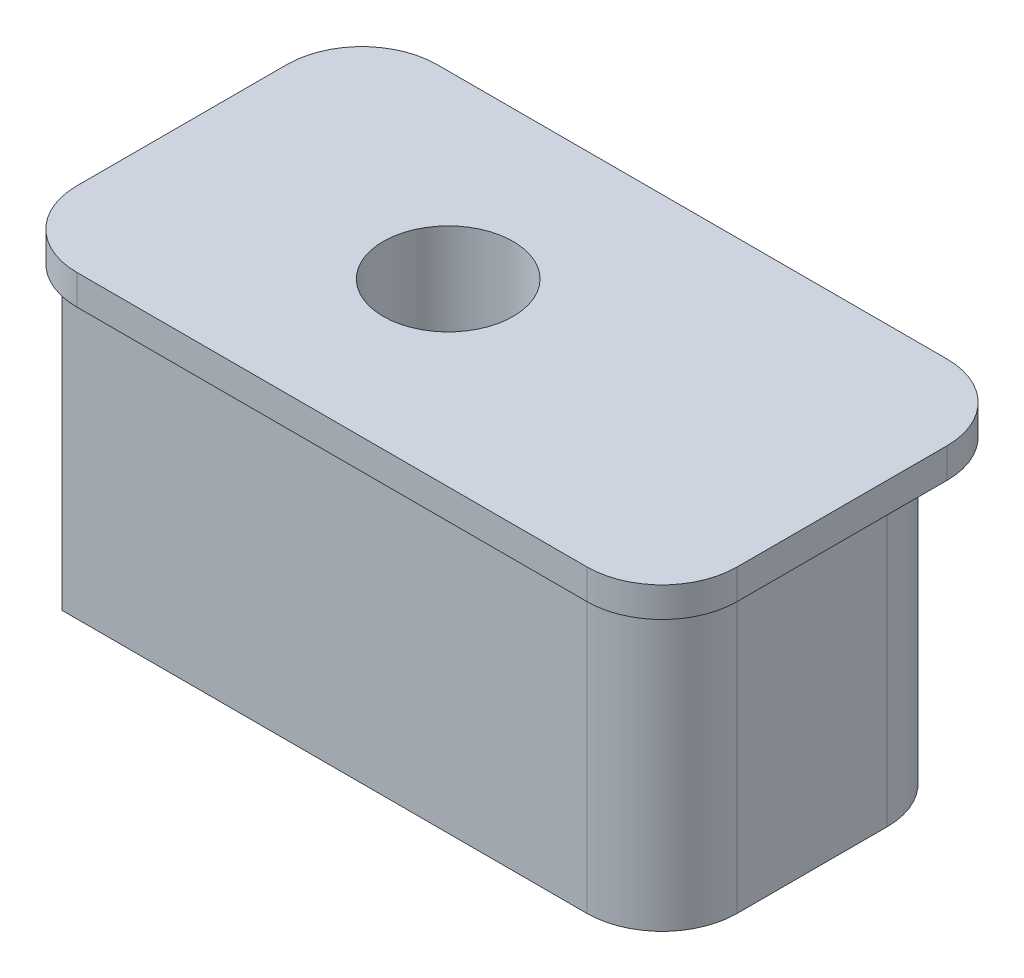
ISO-10303-21;
HEADER;
FILE_DESCRIPTION(('STEP AP214'),'2;1');
FILE_NAME('part.step','',(''),(''),'','','');
FILE_SCHEMA(('AUTOMOTIVE_DESIGN { 1 0 10303 214 1 1 1 1 }'));
ENDSEC;
DATA;
#1=APPLICATION_CONTEXT('core data for automotive mechanical design processes');
#2=APPLICATION_PROTOCOL_DEFINITION('international standard','automotive_design',2000,#1);
#3=PRODUCT_CONTEXT('',#1,'mechanical');
#4=PRODUCT('Part','Part','',(#3));
#5=PRODUCT_RELATED_PRODUCT_CATEGORY('part','',(#4));
#6=PRODUCT_DEFINITION_FORMATION('','',#4);
#7=PRODUCT_DEFINITION_CONTEXT('part definition',#1,'design');
#8=PRODUCT_DEFINITION('design','',#6,#7);
#9=PRODUCT_DEFINITION_SHAPE('','',#8);
#10=(LENGTH_UNIT() NAMED_UNIT(*) SI_UNIT(.MILLI.,.METRE.));
#11=(NAMED_UNIT(*) PLANE_ANGLE_UNIT() SI_UNIT($,.RADIAN.));
#12=(NAMED_UNIT(*) SI_UNIT($,.STERADIAN.) SOLID_ANGLE_UNIT());
#13=UNCERTAINTY_MEASURE_WITH_UNIT(LENGTH_MEASURE(1.E-05),#10,'distance_accuracy_value','');
#14=(GEOMETRIC_REPRESENTATION_CONTEXT(3) GLOBAL_UNCERTAINTY_ASSIGNED_CONTEXT((#13)) GLOBAL_UNIT_ASSIGNED_CONTEXT((#10,
#11,#12)) REPRESENTATION_CONTEXT('',''));
#15=CARTESIAN_POINT('',(0.,0.,0.));
#16=DIRECTION('',(0.,0.,1.));
#17=DIRECTION('',(1.,0.,0.));
#18=AXIS2_PLACEMENT_3D('',#15,#16,#17);
#19=CARTESIAN_POINT('',(0.,12.7,0.));
#20=DIRECTION('',(1.,0.,0.));
#21=DIRECTION('',(0.,0.,-1.));
#22=AXIS2_PLACEMENT_3D('',#19,#20,#21);
#23=PLANE('',#22);
#24=DIRECTION('',(0.,0.,1.));
#25=VECTOR('',#24,1.);
#26=CARTESIAN_POINT('',(0.,0.,0.));
#27=LINE('',#26,#25);
#28=CARTESIAN_POINT('',(0.,0.,-12.7));
#29=VERTEX_POINT('',#28);
#30=CARTESIAN_POINT('',(0.,0.,0.));
#31=VERTEX_POINT('',#30);
#32=EDGE_CURVE('E266',#29,#31,#27,.T.);
#33=ORIENTED_EDGE('',*,*,#32,.T.);
#34=DIRECTION('',(0.,-1.,0.));
#35=VECTOR('',#34,1.);
#36=CARTESIAN_POINT('',(0.,12.7,0.));
#37=LINE('',#36,#35);
#38=CARTESIAN_POINT('',(0.,12.7,0.));
#39=VERTEX_POINT('',#38);
#40=EDGE_CURVE('E293',#39,#31,#37,.T.);
#41=ORIENTED_EDGE('',*,*,#40,.F.);
#42=DIRECTION('',(0.,0.,1.));
#43=VECTOR('',#42,1.);
#44=CARTESIAN_POINT('',(0.,12.7,0.));
#45=LINE('',#44,#43);
#46=CARTESIAN_POINT('',(0.,12.7,-12.7));
#47=VERTEX_POINT('',#46);
#48=EDGE_CURVE('E268',#47,#39,#45,.T.);
#49=ORIENTED_EDGE('',*,*,#48,.F.);
#50=DIRECTION('',(0.,-1.,0.));
#51=VECTOR('',#50,1.);
#52=CARTESIAN_POINT('',(0.,12.7,-12.7));
#53=LINE('',#52,#51);
#54=EDGE_CURVE('E277',#47,#29,#53,.T.);
#55=ORIENTED_EDGE('',*,*,#54,.T.);
#56=EDGE_LOOP('',(#33,#41,#49,#55));
#57=FACE_BOUND('',#56,.T.);
#58=ADVANCED_FACE('F45',(#57),#23,.F.);
#59=CARTESIAN_POINT('',(0.,12.7,0.));
#60=DIRECTION('',(0.,0.,-1.));
#61=DIRECTION('',(-1.,0.,0.));
#62=AXIS2_PLACEMENT_3D('',#59,#60,#61);
#63=PLANE('',#62);
#64=DIRECTION('',(1.,0.,0.));
#65=VECTOR('',#64,1.);
#66=CARTESIAN_POINT('',(0.,0.,0.));
#67=LINE('',#66,#65);
#68=CARTESIAN_POINT('',(22.225,0.,0.));
#69=VERTEX_POINT('',#68);
#70=EDGE_CURVE('E281',#31,#69,#67,.T.);
#71=ORIENTED_EDGE('',*,*,#70,.T.);
#72=DIRECTION('',(0.,-1.,0.));
#73=VECTOR('',#72,1.);
#74=CARTESIAN_POINT('',(22.225,12.7,0.));
#75=LINE('',#74,#73);
#76=CARTESIAN_POINT('',(22.225,12.7,0.));
#77=VERTEX_POINT('',#76);
#78=EDGE_CURVE('E182',#69,#77,#75,.F.);
#79=ORIENTED_EDGE('',*,*,#78,.T.);
#80=DIRECTION('',(1.,0.,0.));
#81=VECTOR('',#80,1.);
#82=CARTESIAN_POINT('',(0.,12.7,0.));
#83=LINE('',#82,#81);
#84=EDGE_CURVE('E172',#39,#77,#83,.T.);
#85=ORIENTED_EDGE('',*,*,#84,.F.);
#86=ORIENTED_EDGE('',*,*,#40,.T.);
#87=EDGE_LOOP('',(#71,#79,#85,#86));
#88=FACE_BOUND('',#87,.T.);
#89=ADVANCED_FACE('F317',(#88),#63,.F.);
#90=CARTESIAN_POINT('',(25.4,12.7,0.));
#91=DIRECTION('',(-1.,0.,0.));
#92=DIRECTION('',(0.,0.,1.));
#93=AXIS2_PLACEMENT_3D('',#90,#91,#92);
#94=PLANE('',#93);
#95=DIRECTION('',(0.,0.,-1.));
#96=VECTOR('',#95,1.);
#97=CARTESIAN_POINT('',(25.4,0.,0.));
#98=LINE('',#97,#96);
#99=CARTESIAN_POINT('',(25.4,0.,-3.175));
#100=VERTEX_POINT('',#99);
#101=CARTESIAN_POINT('',(25.4,0.,-9.525));
#102=VERTEX_POINT('',#101);
#103=EDGE_CURVE('E285',#100,#102,#98,.T.);
#104=ORIENTED_EDGE('',*,*,#103,.T.);
#105=DIRECTION('',(0.,-1.,0.));
#106=VECTOR('',#105,1.);
#107=CARTESIAN_POINT('',(25.4,12.7,-9.525));
#108=LINE('',#107,#106);
#109=CARTESIAN_POINT('',(25.4,12.7,-9.525));
#110=VERTEX_POINT('',#109);
#111=EDGE_CURVE('E160',#102,#110,#108,.F.);
#112=ORIENTED_EDGE('',*,*,#111,.T.);
#113=DIRECTION('',(0.,0.,-1.));
#114=VECTOR('',#113,1.);
#115=CARTESIAN_POINT('',(25.4,12.7,0.));
#116=LINE('',#115,#114);
#117=CARTESIAN_POINT('',(25.4,12.7,-3.175));
#118=VERTEX_POINT('',#117);
#119=EDGE_CURVE('E164',#118,#110,#116,.T.);
#120=ORIENTED_EDGE('',*,*,#119,.F.);
#121=DIRECTION('',(0.,-1.,0.));
#122=VECTOR('',#121,1.);
#123=CARTESIAN_POINT('',(25.4,12.7,-3.175));
#124=LINE('',#123,#122);
#125=EDGE_CURVE('E148',#118,#100,#124,.T.);
#126=ORIENTED_EDGE('',*,*,#125,.T.);
#127=EDGE_LOOP('',(#104,#112,#120,#126));
#128=FACE_BOUND('',#127,.T.);
#129=ADVANCED_FACE('F165',(#128),#94,.F.);
#130=CARTESIAN_POINT('',(0.,12.7,-12.7));
#131=DIRECTION('',(0.,0.,1.));
#132=DIRECTION('',(1.,0.,0.));
#133=AXIS2_PLACEMENT_3D('',#130,#131,#132);
#134=PLANE('',#133);
#135=DIRECTION('',(-1.,0.,0.));
#136=VECTOR('',#135,1.);
#137=CARTESIAN_POINT('',(0.,12.7,-12.7));
#138=LINE('',#137,#136);
#139=CARTESIAN_POINT('',(22.225,12.7,-12.7));
#140=VERTEX_POINT('',#139);
#141=EDGE_CURVE('E171',#140,#47,#138,.T.);
#142=ORIENTED_EDGE('',*,*,#141,.F.);
#143=DIRECTION('',(0.,-1.,0.));
#144=VECTOR('',#143,1.);
#145=CARTESIAN_POINT('',(22.225,12.7,-12.7));
#146=LINE('',#145,#144);
#147=CARTESIAN_POINT('',(22.225,0.,-12.7));
#148=VERTEX_POINT('',#147);
#149=EDGE_CURVE('E297',#140,#148,#146,.T.);
#150=ORIENTED_EDGE('',*,*,#149,.T.);
#151=DIRECTION('',(-1.,0.,0.));
#152=VECTOR('',#151,1.);
#153=CARTESIAN_POINT('',(0.,0.,-12.7));
#154=LINE('',#153,#152);
#155=EDGE_CURVE('E271',#148,#29,#154,.T.);
#156=ORIENTED_EDGE('',*,*,#155,.T.);
#157=ORIENTED_EDGE('',*,*,#54,.F.);
#158=EDGE_LOOP('',(#142,#150,#156,#157));
#159=FACE_BOUND('',#158,.T.);
#160=ADVANCED_FACE('F313',(#159),#134,.F.);
#161=CARTESIAN_POINT('',(0.,0.,0.));
#162=DIRECTION('',(0.,-1.,0.));
#163=DIRECTION('',(0.,0.,-1.));
#164=AXIS2_PLACEMENT_3D('',#161,#162,#163);
#165=PLANE('',#164);
#166=CARTESIAN_POINT('',(10.,0.,-6.35));
#167=DIRECTION('',(0.,1.,0.));
#168=DIRECTION('',(0.,0.,1.));
#169=AXIS2_PLACEMENT_3D('',#166,#167,#168);
#170=CIRCLE('',#169,2.75);
#171=CARTESIAN_POINT('',(10.,0.,-3.6));
#172=VERTEX_POINT('',#171);
#173=EDGE_CURVE('E262',#172,#172,#170,.T.);
#174=ORIENTED_EDGE('',*,*,#173,.T.);
#175=EDGE_LOOP('',(#174));
#176=FACE_BOUND('',#175,.T.);
#177=ORIENTED_EDGE('',*,*,#155,.F.);
#178=CARTESIAN_POINT('',(22.225,0.,-9.525));
#179=DIRECTION('',(0.,-1.,0.));
#180=DIRECTION('',(0.,0.,-1.));
#181=AXIS2_PLACEMENT_3D('',#178,#179,#180);
#182=CIRCLE('',#181,3.175);
#183=EDGE_CURVE('E161',#148,#102,#182,.T.);
#184=ORIENTED_EDGE('',*,*,#183,.T.);
#185=ORIENTED_EDGE('',*,*,#103,.F.);
#186=CARTESIAN_POINT('',(22.225,0.,-3.175));
#187=DIRECTION('',(0.,-1.,0.));
#188=DIRECTION('',(0.,0.,-1.));
#189=AXIS2_PLACEMENT_3D('',#186,#187,#188);
#190=CIRCLE('',#189,3.175);
#191=EDGE_CURVE('E155',#100,#69,#190,.T.);
#192=ORIENTED_EDGE('',*,*,#191,.T.);
#193=ORIENTED_EDGE('',*,*,#70,.F.);
#194=ORIENTED_EDGE('',*,*,#32,.F.);
#195=EDGE_LOOP('',(#177,#184,#185,#192,#193,#194));
#196=FACE_BOUND('',#195,.T.);
#197=ADVANCED_FACE('F306',(#176,#196),#165,.T.);
#198=CARTESIAN_POINT('',(22.225,12.7,-9.525));
#199=DIRECTION('',(0.,-1.,0.));
#200=DIRECTION('',(0.,0.,-1.));
#201=AXIS2_PLACEMENT_3D('',#198,#199,#200);
#202=CYLINDRICAL_SURFACE('',#201,3.175);
#203=CARTESIAN_POINT('',(22.225,12.7,-9.525));
#204=DIRECTION('',(0.,-1.,0.));
#205=DIRECTION('',(0.,0.,-1.));
#206=AXIS2_PLACEMENT_3D('',#203,#204,#205);
#207=CIRCLE('',#206,3.175);
#208=EDGE_CURVE('E178',#110,#140,#207,.F.);
#209=ORIENTED_EDGE('',*,*,#208,.F.);
#210=ORIENTED_EDGE('',*,*,#111,.F.);
#211=ORIENTED_EDGE('',*,*,#183,.F.);
#212=ORIENTED_EDGE('',*,*,#149,.F.);
#213=EDGE_LOOP('',(#209,#210,#211,#212));
#214=FACE_BOUND('',#213,.T.);
#215=ADVANCED_FACE('F310',(#214),#202,.T.);
#216=CARTESIAN_POINT('',(22.225,12.7,-3.175));
#217=DIRECTION('',(0.,-1.,0.));
#218=DIRECTION('',(0.,0.,-1.));
#219=AXIS2_PLACEMENT_3D('',#216,#217,#218);
#220=CYLINDRICAL_SURFACE('',#219,3.175);
#221=CARTESIAN_POINT('',(22.225,12.7,-3.175));
#222=DIRECTION('',(0.,-1.,0.));
#223=DIRECTION('',(0.,0.,-1.));
#224=AXIS2_PLACEMENT_3D('',#221,#222,#223);
#225=CIRCLE('',#224,3.175);
#226=EDGE_CURVE('E153',#77,#118,#225,.F.);
#227=ORIENTED_EDGE('',*,*,#226,.F.);
#228=ORIENTED_EDGE('',*,*,#78,.F.);
#229=ORIENTED_EDGE('',*,*,#191,.F.);
#230=ORIENTED_EDGE('',*,*,#125,.F.);
#231=EDGE_LOOP('',(#227,#228,#229,#230));
#232=FACE_BOUND('',#231,.T.);
#233=ADVANCED_FACE('F150',(#232),#220,.T.);
#234=CARTESIAN_POINT('',(10.,0.,-6.35));
#235=DIRECTION('',(0.,1.,0.));
#236=DIRECTION('',(0.,0.,1.));
#237=AXIS2_PLACEMENT_3D('',#234,#235,#236);
#238=CYLINDRICAL_SURFACE('',#237,2.75);
#239=ORIENTED_EDGE('',*,*,#173,.F.);
#240=EDGE_LOOP('',(#239));
#241=FACE_BOUND('',#240,.T.);
#242=CARTESIAN_POINT('',(10.,13.97,-6.35));
#243=DIRECTION('',(0.,1.,0.));
#244=DIRECTION('',(0.,0.,1.));
#245=AXIS2_PLACEMENT_3D('',#242,#243,#244);
#246=CIRCLE('',#245,2.75);
#247=CARTESIAN_POINT('',(10.,13.97,-3.6));
#248=VERTEX_POINT('',#247);
#249=EDGE_CURVE('E254',#248,#248,#246,.T.);
#250=ORIENTED_EDGE('',*,*,#249,.T.);
#251=EDGE_LOOP('',(#250));
#252=FACE_BOUND('',#251,.T.);
#253=ADVANCED_FACE('F332',(#241,#252),#238,.F.);
#254=CARTESIAN_POINT('',(0.,13.97,0.));
#255=DIRECTION('',(0.,-1.,0.));
#256=DIRECTION('',(0.,0.,-1.));
#257=AXIS2_PLACEMENT_3D('',#254,#255,#256);
#258=PLANE('',#257);
#259=DIRECTION('',(-1.,0.,0.));
#260=VECTOR('',#259,1.);
#261=CARTESIAN_POINT('',(-1.27,13.97,-13.97));
#262=LINE('',#261,#260);
#263=CARTESIAN_POINT('',(23.495,13.97,-13.97));
#264=VERTEX_POINT('',#263);
#265=CARTESIAN_POINT('',(1.905,13.97,-13.97));
#266=VERTEX_POINT('',#265);
#267=EDGE_CURVE('E267',#264,#266,#262,.T.);
#268=ORIENTED_EDGE('',*,*,#267,.T.);
#269=CARTESIAN_POINT('',(1.905,13.97,-10.795));
#270=DIRECTION('',(0.,-1.,0.));
#271=DIRECTION('',(0.,0.,-1.));
#272=AXIS2_PLACEMENT_3D('',#269,#270,#271);
#273=CIRCLE('',#272,3.175);
#274=CARTESIAN_POINT('',(-1.27,13.97,-10.795));
#275=VERTEX_POINT('',#274);
#276=EDGE_CURVE('E222',#266,#275,#273,.F.);
#277=ORIENTED_EDGE('',*,*,#276,.T.);
#278=DIRECTION('',(0.,0.,1.));
#279=VECTOR('',#278,1.);
#280=CARTESIAN_POINT('',(-1.27,13.97,1.27));
#281=LINE('',#280,#279);
#282=CARTESIAN_POINT('',(-1.27,13.97,-1.905));
#283=VERTEX_POINT('',#282);
#284=EDGE_CURVE('E261',#275,#283,#281,.T.);
#285=ORIENTED_EDGE('',*,*,#284,.T.);
#286=CARTESIAN_POINT('',(1.905,13.97,-1.905));
#287=DIRECTION('',(0.,-1.,0.));
#288=DIRECTION('',(0.,0.,-1.));
#289=AXIS2_PLACEMENT_3D('',#286,#287,#288);
#290=CIRCLE('',#289,3.175);
#291=CARTESIAN_POINT('',(1.905,13.97,1.27));
#292=VERTEX_POINT('',#291);
#293=EDGE_CURVE('E214',#283,#292,#290,.F.);
#294=ORIENTED_EDGE('',*,*,#293,.T.);
#295=DIRECTION('',(1.,0.,0.));
#296=VECTOR('',#295,1.);
#297=CARTESIAN_POINT('',(-1.27,13.97,1.27));
#298=LINE('',#297,#296);
#299=CARTESIAN_POINT('',(23.495,13.97,1.27));
#300=VERTEX_POINT('',#299);
#301=EDGE_CURVE('E240',#292,#300,#298,.T.);
#302=ORIENTED_EDGE('',*,*,#301,.T.);
#303=CARTESIAN_POINT('',(23.495,13.97,-1.905));
#304=DIRECTION('',(0.,-1.,0.));
#305=DIRECTION('',(0.,0.,-1.));
#306=AXIS2_PLACEMENT_3D('',#303,#304,#305);
#307=CIRCLE('',#306,3.175);
#308=CARTESIAN_POINT('',(26.67,13.97,-1.905));
#309=VERTEX_POINT('',#308);
#310=EDGE_CURVE('E68',#300,#309,#307,.F.);
#311=ORIENTED_EDGE('',*,*,#310,.T.);
#312=DIRECTION('',(0.,0.,-1.));
#313=VECTOR('',#312,1.);
#314=CARTESIAN_POINT('',(26.67,13.97,1.27));
#315=LINE('',#314,#313);
#316=CARTESIAN_POINT('',(26.67,13.97,-10.795));
#317=VERTEX_POINT('',#316);
#318=EDGE_CURVE('E349',#309,#317,#315,.T.);
#319=ORIENTED_EDGE('',*,*,#318,.T.);
#320=CARTESIAN_POINT('',(23.495,13.97,-10.795));
#321=DIRECTION('',(0.,-1.,0.));
#322=DIRECTION('',(0.,0.,-1.));
#323=AXIS2_PLACEMENT_3D('',#320,#321,#322);
#324=CIRCLE('',#323,3.175);
#325=EDGE_CURVE('E219',#317,#264,#324,.F.);
#326=ORIENTED_EDGE('',*,*,#325,.T.);
#327=EDGE_LOOP('',(#268,#277,#285,#294,#302,#311,#319,#326));
#328=FACE_BOUND('',#327,.T.);
#329=ORIENTED_EDGE('',*,*,#249,.F.);
#330=EDGE_LOOP('',(#329));
#331=FACE_BOUND('',#330,.T.);
#332=ADVANCED_FACE('F372',(#328,#331),#258,.F.);
#333=CARTESIAN_POINT('',(0.,12.7,0.));
#334=DIRECTION('',(0.,-1.,0.));
#335=DIRECTION('',(0.,0.,-1.));
#336=AXIS2_PLACEMENT_3D('',#333,#334,#335);
#337=PLANE('',#336);
#338=ORIENTED_EDGE('',*,*,#226,.T.);
#339=ORIENTED_EDGE('',*,*,#119,.T.);
#340=ORIENTED_EDGE('',*,*,#208,.T.);
#341=ORIENTED_EDGE('',*,*,#141,.T.);
#342=ORIENTED_EDGE('',*,*,#48,.T.);
#343=ORIENTED_EDGE('',*,*,#84,.T.);
#344=EDGE_LOOP('',(#338,#339,#340,#341,#342,#343));
#345=FACE_BOUND('',#344,.T.);
#346=DIRECTION('',(0.,0.,1.));
#347=VECTOR('',#346,1.);
#348=CARTESIAN_POINT('',(-1.27,12.7,1.27));
#349=LINE('',#348,#347);
#350=CARTESIAN_POINT('',(-1.27,12.7,-10.795));
#351=VERTEX_POINT('',#350);
#352=CARTESIAN_POINT('',(-1.27,12.7,-1.905));
#353=VERTEX_POINT('',#352);
#354=EDGE_CURVE('E248',#351,#353,#349,.T.);
#355=ORIENTED_EDGE('',*,*,#354,.F.);
#356=CARTESIAN_POINT('',(1.905,12.7,-10.795));
#357=DIRECTION('',(0.,-1.,0.));
#358=DIRECTION('',(0.,0.,-1.));
#359=AXIS2_PLACEMENT_3D('',#356,#357,#358);
#360=CIRCLE('',#359,3.175);
#361=CARTESIAN_POINT('',(1.905,12.7,-13.97));
#362=VERTEX_POINT('',#361);
#363=EDGE_CURVE('E204',#351,#362,#360,.T.);
#364=ORIENTED_EDGE('',*,*,#363,.T.);
#365=DIRECTION('',(-1.,0.,0.));
#366=VECTOR('',#365,1.);
#367=CARTESIAN_POINT('',(-1.27,12.7,-13.97));
#368=LINE('',#367,#366);
#369=CARTESIAN_POINT('',(23.495,12.7,-13.97));
#370=VERTEX_POINT('',#369);
#371=EDGE_CURVE('E252',#370,#362,#368,.T.);
#372=ORIENTED_EDGE('',*,*,#371,.F.);
#373=CARTESIAN_POINT('',(23.495,12.7,-10.795));
#374=DIRECTION('',(0.,-1.,0.));
#375=DIRECTION('',(0.,0.,-1.));
#376=AXIS2_PLACEMENT_3D('',#373,#374,#375);
#377=CIRCLE('',#376,3.175);
#378=CARTESIAN_POINT('',(26.67,12.7,-10.795));
#379=VERTEX_POINT('',#378);
#380=EDGE_CURVE('E201',#370,#379,#377,.T.);
#381=ORIENTED_EDGE('',*,*,#380,.T.);
#382=DIRECTION('',(0.,0.,-1.));
#383=VECTOR('',#382,1.);
#384=CARTESIAN_POINT('',(26.67,12.7,1.27));
#385=LINE('',#384,#383);
#386=CARTESIAN_POINT('',(26.67,12.7,-1.905));
#387=VERTEX_POINT('',#386);
#388=EDGE_CURVE('E247',#387,#379,#385,.T.);
#389=ORIENTED_EDGE('',*,*,#388,.F.);
#390=CARTESIAN_POINT('',(23.495,12.7,-1.905));
#391=DIRECTION('',(0.,-1.,0.));
#392=DIRECTION('',(0.,0.,-1.));
#393=AXIS2_PLACEMENT_3D('',#390,#391,#392);
#394=CIRCLE('',#393,3.175);
#395=CARTESIAN_POINT('',(23.495,12.7,1.27));
#396=VERTEX_POINT('',#395);
#397=EDGE_CURVE('E198',#387,#396,#394,.T.);
#398=ORIENTED_EDGE('',*,*,#397,.T.);
#399=DIRECTION('',(1.,0.,0.));
#400=VECTOR('',#399,1.);
#401=CARTESIAN_POINT('',(-1.27,12.7,1.27));
#402=LINE('',#401,#400);
#403=CARTESIAN_POINT('',(1.905,12.7,1.27));
#404=VERTEX_POINT('',#403);
#405=EDGE_CURVE('E238',#404,#396,#402,.T.);
#406=ORIENTED_EDGE('',*,*,#405,.F.);
#407=CARTESIAN_POINT('',(1.905,12.7,-1.905));
#408=DIRECTION('',(0.,-1.,0.));
#409=DIRECTION('',(0.,0.,-1.));
#410=AXIS2_PLACEMENT_3D('',#407,#408,#409);
#411=CIRCLE('',#410,3.175);
#412=EDGE_CURVE('E195',#404,#353,#411,.T.);
#413=ORIENTED_EDGE('',*,*,#412,.T.);
#414=EDGE_LOOP('',(#355,#364,#372,#381,#389,#398,#406,#413));
#415=FACE_BOUND('',#414,.T.);
#416=ADVANCED_FACE('F174',(#345,#415),#337,.T.);
#417=CARTESIAN_POINT('',(-1.27,13.97,1.27));
#418=DIRECTION('',(1.,0.,0.));
#419=DIRECTION('',(0.,0.,-1.));
#420=AXIS2_PLACEMENT_3D('',#417,#418,#419);
#421=PLANE('',#420);
#422=ORIENTED_EDGE('',*,*,#284,.F.);
#423=DIRECTION('',(0.,-1.,0.));
#424=VECTOR('',#423,1.);
#425=CARTESIAN_POINT('',(-1.27,13.97,-10.795));
#426=LINE('',#425,#424);
#427=EDGE_CURVE('E191',#275,#351,#426,.T.);
#428=ORIENTED_EDGE('',*,*,#427,.T.);
#429=ORIENTED_EDGE('',*,*,#354,.T.);
#430=DIRECTION('',(0.,-1.,0.));
#431=VECTOR('',#430,1.);
#432=CARTESIAN_POINT('',(-1.27,13.97,-1.905));
#433=LINE('',#432,#431);
#434=EDGE_CURVE('E188',#353,#283,#433,.F.);
#435=ORIENTED_EDGE('',*,*,#434,.T.);
#436=EDGE_LOOP('',(#422,#428,#429,#435));
#437=FACE_BOUND('',#436,.T.);
#438=ADVANCED_FACE('F379',(#437),#421,.F.);
#439=CARTESIAN_POINT('',(-1.27,13.97,1.27));
#440=DIRECTION('',(0.,0.,-1.));
#441=DIRECTION('',(-1.,0.,0.));
#442=AXIS2_PLACEMENT_3D('',#439,#440,#441);
#443=PLANE('',#442);
#444=ORIENTED_EDGE('',*,*,#405,.T.);
#445=DIRECTION('',(0.,-1.,0.));
#446=VECTOR('',#445,1.);
#447=CARTESIAN_POINT('',(23.495,13.97,1.27));
#448=LINE('',#447,#446);
#449=EDGE_CURVE('E11',#396,#300,#448,.F.);
#450=ORIENTED_EDGE('',*,*,#449,.T.);
#451=ORIENTED_EDGE('',*,*,#301,.F.);
#452=DIRECTION('',(0.,-1.,0.));
#453=VECTOR('',#452,1.);
#454=CARTESIAN_POINT('',(1.905,13.97,1.27));
#455=LINE('',#454,#453);
#456=EDGE_CURVE('E54',#292,#404,#455,.T.);
#457=ORIENTED_EDGE('',*,*,#456,.T.);
#458=EDGE_LOOP('',(#444,#450,#451,#457));
#459=FACE_BOUND('',#458,.T.);
#460=ADVANCED_FACE('F237',(#459),#443,.F.);
#461=CARTESIAN_POINT('',(26.67,13.97,1.27));
#462=DIRECTION('',(-1.,0.,0.));
#463=DIRECTION('',(0.,0.,1.));
#464=AXIS2_PLACEMENT_3D('',#461,#462,#463);
#465=PLANE('',#464);
#466=ORIENTED_EDGE('',*,*,#388,.T.);
#467=DIRECTION('',(0.,-1.,0.));
#468=VECTOR('',#467,1.);
#469=CARTESIAN_POINT('',(26.67,13.97,-10.795));
#470=LINE('',#469,#468);
#471=EDGE_CURVE('E61',#379,#317,#470,.F.);
#472=ORIENTED_EDGE('',*,*,#471,.T.);
#473=ORIENTED_EDGE('',*,*,#318,.F.);
#474=DIRECTION('',(0.,-1.,0.));
#475=VECTOR('',#474,1.);
#476=CARTESIAN_POINT('',(26.67,13.97,-1.905));
#477=LINE('',#476,#475);
#478=EDGE_CURVE('E225',#309,#387,#477,.T.);
#479=ORIENTED_EDGE('',*,*,#478,.T.);
#480=EDGE_LOOP('',(#466,#472,#473,#479));
#481=FACE_BOUND('',#480,.T.);
#482=ADVANCED_FACE('F348',(#481),#465,.F.);
#483=CARTESIAN_POINT('',(-1.27,13.97,-13.97));
#484=DIRECTION('',(0.,0.,1.));
#485=DIRECTION('',(1.,0.,0.));
#486=AXIS2_PLACEMENT_3D('',#483,#484,#485);
#487=PLANE('',#486);
#488=ORIENTED_EDGE('',*,*,#371,.T.);
#489=DIRECTION('',(0.,-1.,0.));
#490=VECTOR('',#489,1.);
#491=CARTESIAN_POINT('',(1.905,13.97,-13.97));
#492=LINE('',#491,#490);
#493=EDGE_CURVE('E211',#362,#266,#492,.F.);
#494=ORIENTED_EDGE('',*,*,#493,.T.);
#495=ORIENTED_EDGE('',*,*,#267,.F.);
#496=DIRECTION('',(0.,-1.,0.));
#497=VECTOR('',#496,1.);
#498=CARTESIAN_POINT('',(23.495,13.97,-13.97));
#499=LINE('',#498,#497);
#500=EDGE_CURVE('E207',#264,#370,#499,.T.);
#501=ORIENTED_EDGE('',*,*,#500,.T.);
#502=EDGE_LOOP('',(#488,#494,#495,#501));
#503=FACE_BOUND('',#502,.T.);
#504=ADVANCED_FACE('F337',(#503),#487,.F.);
#505=CARTESIAN_POINT('',(1.905,13.97,-10.795));
#506=DIRECTION('',(0.,-1.,0.));
#507=DIRECTION('',(0.,0.,-1.));
#508=AXIS2_PLACEMENT_3D('',#505,#506,#507);
#509=CYLINDRICAL_SURFACE('',#508,3.175);
#510=ORIENTED_EDGE('',*,*,#276,.F.);
#511=ORIENTED_EDGE('',*,*,#493,.F.);
#512=ORIENTED_EDGE('',*,*,#363,.F.);
#513=ORIENTED_EDGE('',*,*,#427,.F.);
#514=EDGE_LOOP('',(#510,#511,#512,#513));
#515=FACE_BOUND('',#514,.T.);
#516=ADVANCED_FACE('F333',(#515),#509,.T.);
#517=CARTESIAN_POINT('',(23.495,13.97,-10.795));
#518=DIRECTION('',(0.,-1.,0.));
#519=DIRECTION('',(0.,0.,-1.));
#520=AXIS2_PLACEMENT_3D('',#517,#518,#519);
#521=CYLINDRICAL_SURFACE('',#520,3.175);
#522=ORIENTED_EDGE('',*,*,#325,.F.);
#523=ORIENTED_EDGE('',*,*,#471,.F.);
#524=ORIENTED_EDGE('',*,*,#380,.F.);
#525=ORIENTED_EDGE('',*,*,#500,.F.);
#526=EDGE_LOOP('',(#522,#523,#524,#525));
#527=FACE_BOUND('',#526,.T.);
#528=ADVANCED_FACE('F336',(#527),#521,.T.);
#529=CARTESIAN_POINT('',(23.495,13.97,-1.905));
#530=DIRECTION('',(0.,-1.,0.));
#531=DIRECTION('',(0.,0.,-1.));
#532=AXIS2_PLACEMENT_3D('',#529,#530,#531);
#533=CYLINDRICAL_SURFACE('',#532,3.175);
#534=ORIENTED_EDGE('',*,*,#310,.F.);
#535=ORIENTED_EDGE('',*,*,#449,.F.);
#536=ORIENTED_EDGE('',*,*,#397,.F.);
#537=ORIENTED_EDGE('',*,*,#478,.F.);
#538=EDGE_LOOP('',(#534,#535,#536,#537));
#539=FACE_BOUND('',#538,.T.);
#540=ADVANCED_FACE('F340',(#539),#533,.T.);
#541=CARTESIAN_POINT('',(1.905,13.97,-1.905));
#542=DIRECTION('',(0.,-1.,0.));
#543=DIRECTION('',(0.,0.,-1.));
#544=AXIS2_PLACEMENT_3D('',#541,#542,#543);
#545=CYLINDRICAL_SURFACE('',#544,3.175);
#546=ORIENTED_EDGE('',*,*,#293,.F.);
#547=ORIENTED_EDGE('',*,*,#434,.F.);
#548=ORIENTED_EDGE('',*,*,#412,.F.);
#549=ORIENTED_EDGE('',*,*,#456,.F.);
#550=EDGE_LOOP('',(#546,#547,#548,#549));
#551=FACE_BOUND('',#550,.T.);
#552=ADVANCED_FACE('F47',(#551),#545,.T.);
#553=CLOSED_SHELL('',(#58,#89,#129,#160,#197,#215,#233,#253,#332,#416,#438,#460,#482,#504,#516,
#528,#540,#552));
#554=MANIFOLD_SOLID_BREP('B2',#553);
#555=ADVANCED_BREP_SHAPE_REPRESENTATION('',(#18,#554),#14);
#556=SHAPE_DEFINITION_REPRESENTATION(#9,#555);
ENDSEC;
END-ISO-10303-21;
